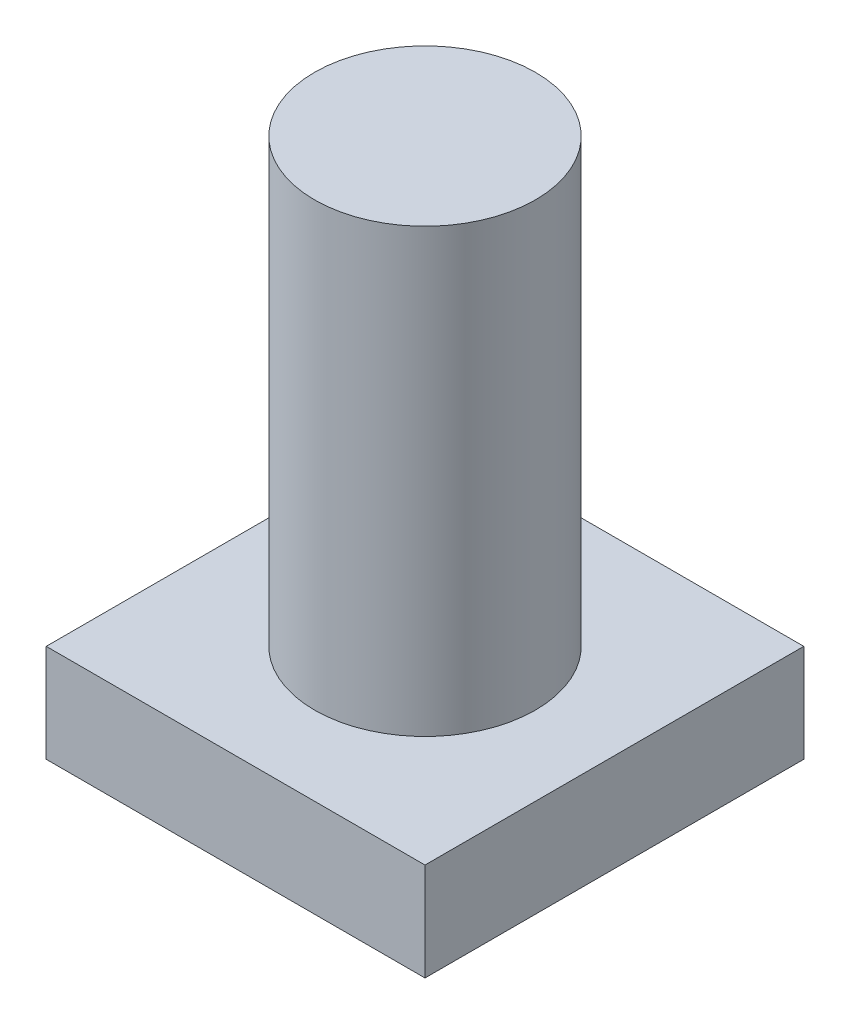
ISO-10303-21;
HEADER;
FILE_DESCRIPTION(('STEP AP214'),'2;1');
FILE_NAME('part.step','',(''),(''),'','','');
FILE_SCHEMA(('AUTOMOTIVE_DESIGN { 1 0 10303 214 1 1 1 1 }'));
ENDSEC;
DATA;
#1=APPLICATION_CONTEXT('core data for automotive mechanical design processes');
#2=APPLICATION_PROTOCOL_DEFINITION('international standard','automotive_design',2000,#1);
#3=PRODUCT_CONTEXT('',#1,'mechanical');
#4=PRODUCT('Part','Part','',(#3));
#5=PRODUCT_RELATED_PRODUCT_CATEGORY('part','',(#4));
#6=PRODUCT_DEFINITION_FORMATION('','',#4);
#7=PRODUCT_DEFINITION_CONTEXT('part definition',#1,'design');
#8=PRODUCT_DEFINITION('design','',#6,#7);
#9=PRODUCT_DEFINITION_SHAPE('','',#8);
#10=(LENGTH_UNIT() NAMED_UNIT(*) SI_UNIT(.MILLI.,.METRE.));
#11=(NAMED_UNIT(*) PLANE_ANGLE_UNIT() SI_UNIT($,.RADIAN.));
#12=(NAMED_UNIT(*) SI_UNIT($,.STERADIAN.) SOLID_ANGLE_UNIT());
#13=UNCERTAINTY_MEASURE_WITH_UNIT(LENGTH_MEASURE(1.E-05),#10,'distance_accuracy_value','');
#14=(GEOMETRIC_REPRESENTATION_CONTEXT(3) GLOBAL_UNCERTAINTY_ASSIGNED_CONTEXT((#13)) GLOBAL_UNIT_ASSIGNED_CONTEXT((#10,
#11,#12)) REPRESENTATION_CONTEXT('',''));
#15=CARTESIAN_POINT('',(0.,0.,0.));
#16=DIRECTION('',(0.,0.,1.));
#17=DIRECTION('',(1.,0.,0.));
#18=AXIS2_PLACEMENT_3D('',#15,#16,#17);
#19=CARTESIAN_POINT('',(-6.,3.1,-6.));
#20=DIRECTION('',(0.,1.,0.));
#21=DIRECTION('',(0.,0.,1.));
#22=AXIS2_PLACEMENT_3D('',#19,#20,#21);
#23=PLANE('',#22);
#24=DIRECTION('',(0.,0.,1.));
#25=VECTOR('',#24,1.);
#26=CARTESIAN_POINT('',(-6.,3.1,-6.));
#27=LINE('',#26,#25);
#28=CARTESIAN_POINT('',(-6.,3.1,-6.));
#29=VERTEX_POINT('',#28);
#30=CARTESIAN_POINT('',(-6.,3.1,6.));
#31=VERTEX_POINT('',#30);
#32=EDGE_CURVE('E103',#29,#31,#27,.T.);
#33=ORIENTED_EDGE('',*,*,#32,.T.);
#34=DIRECTION('',(1.,0.,0.));
#35=VECTOR('',#34,1.);
#36=CARTESIAN_POINT('',(-6.,3.1,6.));
#37=LINE('',#36,#35);
#38=CARTESIAN_POINT('',(6.00000000000003,3.1,6.));
#39=VERTEX_POINT('',#38);
#40=EDGE_CURVE('E88',#31,#39,#37,.T.);
#41=ORIENTED_EDGE('',*,*,#40,.T.);
#42=DIRECTION('',(0.,0.,-1.));
#43=VECTOR('',#42,1.);
#44=CARTESIAN_POINT('',(6.,3.1,-6.));
#45=LINE('',#44,#43);
#46=CARTESIAN_POINT('',(6.,3.1,-6.));
#47=VERTEX_POINT('',#46);
#48=EDGE_CURVE('E55',#39,#47,#45,.T.);
#49=ORIENTED_EDGE('',*,*,#48,.T.);
#50=DIRECTION('',(-1.,0.,0.));
#51=VECTOR('',#50,1.);
#52=CARTESIAN_POINT('',(-6.,3.1,-6.));
#53=LINE('',#52,#51);
#54=EDGE_CURVE('E50',#47,#29,#53,.T.);
#55=ORIENTED_EDGE('',*,*,#54,.T.);
#56=EDGE_LOOP('',(#33,#41,#49,#55));
#57=FACE_BOUND('',#56,.T.);
#58=CARTESIAN_POINT('',(0.,3.1,0.));
#59=DIRECTION('',(0.,1.,0.));
#60=DIRECTION('',(0.,0.,1.));
#61=AXIS2_PLACEMENT_3D('',#58,#59,#60);
#62=CIRCLE('',#61,3.5);
#63=CARTESIAN_POINT('',(0.,3.1,3.5));
#64=VERTEX_POINT('',#63);
#65=EDGE_CURVE('E96',#64,#64,#62,.T.);
#66=ORIENTED_EDGE('',*,*,#65,.F.);
#67=EDGE_LOOP('',(#66));
#68=FACE_BOUND('',#67,.T.);
#69=ADVANCED_FACE('F35',(#57,#68),#23,.T.);
#70=CARTESIAN_POINT('',(-6.,3.1,-6.));
#71=DIRECTION('',(1.,0.,0.));
#72=DIRECTION('',(0.,0.,-1.));
#73=AXIS2_PLACEMENT_3D('',#70,#71,#72);
#74=PLANE('',#73);
#75=DIRECTION('',(0.,0.,1.));
#76=VECTOR('',#75,1.);
#77=CARTESIAN_POINT('',(-6.,0.,-6.));
#78=LINE('',#77,#76);
#79=CARTESIAN_POINT('',(-6.,0.,-6.));
#80=VERTEX_POINT('',#79);
#81=CARTESIAN_POINT('',(-6.,0.,6.));
#82=VERTEX_POINT('',#81);
#83=EDGE_CURVE('E80',#80,#82,#78,.T.);
#84=ORIENTED_EDGE('',*,*,#83,.T.);
#85=DIRECTION('',(0.,-1.,0.));
#86=VECTOR('',#85,1.);
#87=CARTESIAN_POINT('',(-6.,3.1,6.));
#88=LINE('',#87,#86);
#89=EDGE_CURVE('E11',#31,#82,#88,.T.);
#90=ORIENTED_EDGE('',*,*,#89,.F.);
#91=ORIENTED_EDGE('',*,*,#32,.F.);
#92=DIRECTION('',(0.,-1.,0.));
#93=VECTOR('',#92,1.);
#94=CARTESIAN_POINT('',(-6.,3.1,-6.));
#95=LINE('',#94,#93);
#96=EDGE_CURVE('E92',#29,#80,#95,.T.);
#97=ORIENTED_EDGE('',*,*,#96,.T.);
#98=EDGE_LOOP('',(#84,#90,#91,#97));
#99=FACE_BOUND('',#98,.T.);
#100=ADVANCED_FACE('F37',(#99),#74,.F.);
#101=CARTESIAN_POINT('',(-6.,3.1,6.));
#102=DIRECTION('',(0.,0.,-1.));
#103=DIRECTION('',(-1.,0.,0.));
#104=AXIS2_PLACEMENT_3D('',#101,#102,#103);
#105=PLANE('',#104);
#106=DIRECTION('',(1.,0.,0.));
#107=VECTOR('',#106,1.);
#108=CARTESIAN_POINT('',(-6.,0.,6.));
#109=LINE('',#108,#107);
#110=CARTESIAN_POINT('',(6.00000000000003,0.,6.));
#111=VERTEX_POINT('',#110);
#112=EDGE_CURVE('E76',#82,#111,#109,.T.);
#113=ORIENTED_EDGE('',*,*,#112,.T.);
#114=DIRECTION('',(0.,-1.,0.));
#115=VECTOR('',#114,1.);
#116=CARTESIAN_POINT('',(6.00000000000003,3.1,6.));
#117=LINE('',#116,#115);
#118=EDGE_CURVE('E43',#39,#111,#117,.T.);
#119=ORIENTED_EDGE('',*,*,#118,.F.);
#120=ORIENTED_EDGE('',*,*,#40,.F.);
#121=ORIENTED_EDGE('',*,*,#89,.T.);
#122=EDGE_LOOP('',(#113,#119,#120,#121));
#123=FACE_BOUND('',#122,.T.);
#124=ADVANCED_FACE('F87',(#123),#105,.F.);
#125=CARTESIAN_POINT('',(6.,3.1,-6.));
#126=DIRECTION('',(-1.,0.,0.));
#127=DIRECTION('',(0.,0.,1.));
#128=AXIS2_PLACEMENT_3D('',#125,#126,#127);
#129=PLANE('',#128);
#130=DIRECTION('',(0.,0.,-1.));
#131=VECTOR('',#130,1.);
#132=CARTESIAN_POINT('',(6.,0.,-6.));
#133=LINE('',#132,#131);
#134=CARTESIAN_POINT('',(6.,0.,-6.));
#135=VERTEX_POINT('',#134);
#136=EDGE_CURVE('E81',#111,#135,#133,.T.);
#137=ORIENTED_EDGE('',*,*,#136,.T.);
#138=DIRECTION('',(0.,-1.,0.));
#139=VECTOR('',#138,1.);
#140=CARTESIAN_POINT('',(6.,3.1,-6.));
#141=LINE('',#140,#139);
#142=EDGE_CURVE('E109',#47,#135,#141,.T.);
#143=ORIENTED_EDGE('',*,*,#142,.F.);
#144=ORIENTED_EDGE('',*,*,#48,.F.);
#145=ORIENTED_EDGE('',*,*,#118,.T.);
#146=EDGE_LOOP('',(#137,#143,#144,#145));
#147=FACE_BOUND('',#146,.T.);
#148=ADVANCED_FACE('F112',(#147),#129,.F.);
#149=CARTESIAN_POINT('',(-6.,3.1,-6.));
#150=DIRECTION('',(0.,0.,1.));
#151=DIRECTION('',(1.,0.,0.));
#152=AXIS2_PLACEMENT_3D('',#149,#150,#151);
#153=PLANE('',#152);
#154=DIRECTION('',(-1.,0.,0.));
#155=VECTOR('',#154,1.);
#156=CARTESIAN_POINT('',(-6.,0.,-6.));
#157=LINE('',#156,#155);
#158=EDGE_CURVE('E101',#135,#80,#157,.T.);
#159=ORIENTED_EDGE('',*,*,#158,.T.);
#160=ORIENTED_EDGE('',*,*,#96,.F.);
#161=ORIENTED_EDGE('',*,*,#54,.F.);
#162=ORIENTED_EDGE('',*,*,#142,.T.);
#163=EDGE_LOOP('',(#159,#160,#161,#162));
#164=FACE_BOUND('',#163,.T.);
#165=ADVANCED_FACE('F114',(#164),#153,.F.);
#166=CARTESIAN_POINT('',(-6.,0.,-6.));
#167=DIRECTION('',(0.,1.,0.));
#168=DIRECTION('',(0.,0.,1.));
#169=AXIS2_PLACEMENT_3D('',#166,#167,#168);
#170=PLANE('',#169);
#171=ORIENTED_EDGE('',*,*,#83,.F.);
#172=ORIENTED_EDGE('',*,*,#158,.F.);
#173=ORIENTED_EDGE('',*,*,#136,.F.);
#174=ORIENTED_EDGE('',*,*,#112,.F.);
#175=EDGE_LOOP('',(#171,#172,#173,#174));
#176=FACE_BOUND('',#175,.T.);
#177=ADVANCED_FACE('F77',(#176),#170,.F.);
#178=CARTESIAN_POINT('',(0.,17.1,0.));
#179=DIRECTION('',(0.,-1.,0.));
#180=DIRECTION('',(0.,0.,-1.));
#181=AXIS2_PLACEMENT_3D('',#178,#179,#180);
#182=CYLINDRICAL_SURFACE('',#181,3.5);
#183=CARTESIAN_POINT('',(0.,17.1,0.));
#184=DIRECTION('',(0.,1.,0.));
#185=DIRECTION('',(0.,0.,1.));
#186=AXIS2_PLACEMENT_3D('',#183,#184,#185);
#187=CIRCLE('',#186,3.5);
#188=CARTESIAN_POINT('',(0.,17.1,3.5));
#189=VERTEX_POINT('',#188);
#190=EDGE_CURVE('E93',#189,#189,#187,.T.);
#191=ORIENTED_EDGE('',*,*,#190,.F.);
#192=EDGE_LOOP('',(#191));
#193=FACE_BOUND('',#192,.T.);
#194=ORIENTED_EDGE('',*,*,#65,.T.);
#195=EDGE_LOOP('',(#194));
#196=FACE_BOUND('',#195,.T.);
#197=ADVANCED_FACE('F121',(#193,#196),#182,.T.);
#198=CARTESIAN_POINT('',(0.,17.1,0.));
#199=DIRECTION('',(0.,1.,0.));
#200=DIRECTION('',(0.,0.,1.));
#201=AXIS2_PLACEMENT_3D('',#198,#199,#200);
#202=PLANE('',#201);
#203=ORIENTED_EDGE('',*,*,#190,.T.);
#204=EDGE_LOOP('',(#203));
#205=FACE_BOUND('',#204,.T.);
#206=ADVANCED_FACE('F123',(#205),#202,.T.);
#207=CLOSED_SHELL('',(#69,#100,#124,#148,#165,#177,#197,#206));
#208=MANIFOLD_SOLID_BREP('B2',#207);
#209=ADVANCED_BREP_SHAPE_REPRESENTATION('',(#18,#208),#14);
#210=SHAPE_DEFINITION_REPRESENTATION(#9,#209);
ENDSEC;
END-ISO-10303-21;
